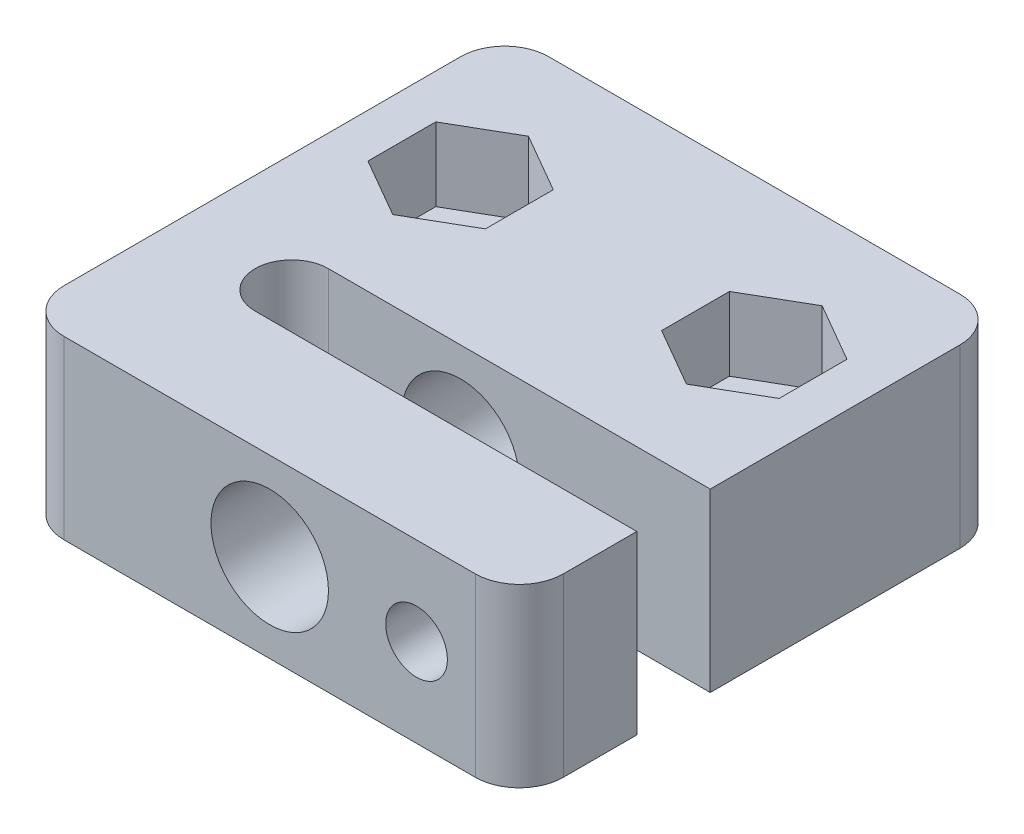
ISO-10303-21;
HEADER;
FILE_DESCRIPTION(('STEP AP214'),'2;1');
FILE_NAME('part.step','',(''),(''),'','','');
FILE_SCHEMA(('AUTOMOTIVE_DESIGN { 1 0 10303 214 1 1 1 1 }'));
ENDSEC;
DATA;
#1=APPLICATION_CONTEXT('core data for automotive mechanical design processes');
#2=APPLICATION_PROTOCOL_DEFINITION('international standard','automotive_design',2000,#1);
#3=PRODUCT_CONTEXT('',#1,'mechanical');
#4=PRODUCT('Part','Part','',(#3));
#5=PRODUCT_RELATED_PRODUCT_CATEGORY('part','',(#4));
#6=PRODUCT_DEFINITION_FORMATION('','',#4);
#7=PRODUCT_DEFINITION_CONTEXT('part definition',#1,'design');
#8=PRODUCT_DEFINITION('design','',#6,#7);
#9=PRODUCT_DEFINITION_SHAPE('','',#8);
#10=(LENGTH_UNIT() NAMED_UNIT(*) SI_UNIT(.MILLI.,.METRE.));
#11=(NAMED_UNIT(*) PLANE_ANGLE_UNIT() SI_UNIT($,.RADIAN.));
#12=(NAMED_UNIT(*) SI_UNIT($,.STERADIAN.) SOLID_ANGLE_UNIT());
#13=UNCERTAINTY_MEASURE_WITH_UNIT(LENGTH_MEASURE(1.E-05),#10,'distance_accuracy_value','');
#14=(GEOMETRIC_REPRESENTATION_CONTEXT(3) GLOBAL_UNCERTAINTY_ASSIGNED_CONTEXT((#13)) GLOBAL_UNIT_ASSIGNED_CONTEXT((#10,
#11,#12)) REPRESENTATION_CONTEXT('',''));
#15=CARTESIAN_POINT('',(0.,0.,0.));
#16=DIRECTION('',(0.,0.,1.));
#17=DIRECTION('',(1.,0.,0.));
#18=AXIS2_PLACEMENT_3D('',#15,#16,#17);
#19=CARTESIAN_POINT('',(17.,12.,-16.5));
#20=DIRECTION('',(-1.,0.,0.));
#21=DIRECTION('',(0.,0.,1.));
#22=AXIS2_PLACEMENT_3D('',#19,#20,#21);
#23=PLANE('',#22);
#24=DIRECTION('',(0.,0.,-1.));
#25=VECTOR('',#24,1.);
#26=CARTESIAN_POINT('',(17.,0.,-16.5));
#27=LINE('',#26,#25);
#28=CARTESIAN_POINT('',(17.,0.,3.5));
#29=VERTEX_POINT('',#28);
#30=CARTESIAN_POINT('',(17.,0.,-13.5));
#31=VERTEX_POINT('',#30);
#32=EDGE_CURVE('E328',#29,#31,#27,.T.);
#33=ORIENTED_EDGE('',*,*,#32,.T.);
#34=DIRECTION('',(0.,-1.,0.));
#35=VECTOR('',#34,1.);
#36=CARTESIAN_POINT('',(17.,12.,-13.5));
#37=LINE('',#36,#35);
#38=CARTESIAN_POINT('',(17.,12.,-13.5));
#39=VERTEX_POINT('',#38);
#40=EDGE_CURVE('E383',#31,#39,#37,.F.);
#41=ORIENTED_EDGE('',*,*,#40,.T.);
#42=DIRECTION('',(0.,0.,-1.));
#43=VECTOR('',#42,1.);
#44=CARTESIAN_POINT('',(17.,12.,-16.5));
#45=LINE('',#44,#43);
#46=CARTESIAN_POINT('',(17.,12.,3.5));
#47=VERTEX_POINT('',#46);
#48=EDGE_CURVE('E338',#47,#39,#45,.T.);
#49=ORIENTED_EDGE('',*,*,#48,.F.);
#50=DIRECTION('',(0.,-1.,0.));
#51=VECTOR('',#50,1.);
#52=CARTESIAN_POINT('',(17.,12.,3.5));
#53=LINE('',#52,#51);
#54=EDGE_CURVE('E325',#47,#29,#53,.T.);
#55=ORIENTED_EDGE('',*,*,#54,.T.);
#56=EDGE_LOOP('',(#33,#41,#49,#55));
#57=FACE_BOUND('',#56,.T.);
#58=ADVANCED_FACE('F37',(#57),#23,.F.);
#59=CARTESIAN_POINT('',(17.,12.,13.5));
#60=VERTEX_POINT('',#59);
#61=CARTESIAN_POINT('',(17.,12.,8.5));
#62=VERTEX_POINT('',#61);
#63=EDGE_CURVE('E335',#60,#62,#45,.T.);
#64=ORIENTED_EDGE('',*,*,#63,.F.);
#65=DIRECTION('',(0.,-1.,0.));
#66=VECTOR('',#65,1.);
#67=CARTESIAN_POINT('',(17.,12.,13.5));
#68=LINE('',#67,#66);
#69=CARTESIAN_POINT('',(17.,0.,13.5));
#70=VERTEX_POINT('',#69);
#71=EDGE_CURVE('E397',#60,#70,#68,.T.);
#72=ORIENTED_EDGE('',*,*,#71,.T.);
#73=CARTESIAN_POINT('',(17.,0.,8.5));
#74=VERTEX_POINT('',#73);
#75=EDGE_CURVE('E347',#70,#74,#27,.T.);
#76=ORIENTED_EDGE('',*,*,#75,.T.);
#77=DIRECTION('',(0.,-1.,0.));
#78=VECTOR('',#77,1.);
#79=CARTESIAN_POINT('',(17.,12.,8.5));
#80=LINE('',#79,#78);
#81=EDGE_CURVE('E318',#62,#74,#80,.T.);
#82=ORIENTED_EDGE('',*,*,#81,.F.);
#83=EDGE_LOOP('',(#64,#72,#76,#82));
#84=FACE_BOUND('',#83,.T.);
#85=ADVANCED_FACE('F415',(#84),#23,.F.);
#86=CARTESIAN_POINT('',(-17.,12.,-16.5));
#87=DIRECTION('',(0.,0.,1.));
#88=DIRECTION('',(1.,0.,0.));
#89=AXIS2_PLACEMENT_3D('',#86,#87,#88);
#90=PLANE('',#89);
#91=CARTESIAN_POINT('',(0.,6.,-16.5));
#92=DIRECTION('',(0.,0.,1.));
#93=DIRECTION('',(1.,0.,0.));
#94=AXIS2_PLACEMENT_3D('',#91,#92,#93);
#95=CIRCLE('',#94,3.99999999999999);
#96=CARTESIAN_POINT('',(3.99999999999999,6.,-16.5));
#97=VERTEX_POINT('',#96);
#98=EDGE_CURVE('E360',#97,#97,#95,.T.);
#99=ORIENTED_EDGE('',*,*,#98,.T.);
#100=EDGE_LOOP('',(#99));
#101=FACE_BOUND('',#100,.T.);
#102=DIRECTION('',(-1.,0.,0.));
#103=VECTOR('',#102,1.);
#104=CARTESIAN_POINT('',(-17.,12.,-16.5));
#105=LINE('',#104,#103);
#106=CARTESIAN_POINT('',(14.,12.,-16.5));
#107=VERTEX_POINT('',#106);
#108=CARTESIAN_POINT('',(-14.,12.,-16.5));
#109=VERTEX_POINT('',#108);
#110=EDGE_CURVE('E337',#107,#109,#105,.T.);
#111=ORIENTED_EDGE('',*,*,#110,.F.);
#112=DIRECTION('',(0.,-1.,0.));
#113=VECTOR('',#112,1.);
#114=CARTESIAN_POINT('',(14.,12.,-16.5));
#115=LINE('',#114,#113);
#116=CARTESIAN_POINT('',(14.,0.,-16.5));
#117=VERTEX_POINT('',#116);
#118=EDGE_CURVE('E372',#107,#117,#115,.T.);
#119=ORIENTED_EDGE('',*,*,#118,.T.);
#120=DIRECTION('',(-1.,0.,0.));
#121=VECTOR('',#120,1.);
#122=CARTESIAN_POINT('',(-17.,0.,-16.5));
#123=LINE('',#122,#121);
#124=CARTESIAN_POINT('',(-14.,0.,-16.5));
#125=VERTEX_POINT('',#124);
#126=EDGE_CURVE('E349',#117,#125,#123,.T.);
#127=ORIENTED_EDGE('',*,*,#126,.T.);
#128=DIRECTION('',(0.,-1.,0.));
#129=VECTOR('',#128,1.);
#130=CARTESIAN_POINT('',(-14.,12.,-16.5));
#131=LINE('',#130,#129);
#132=EDGE_CURVE('E346',#125,#109,#131,.F.);
#133=ORIENTED_EDGE('',*,*,#132,.T.);
#134=EDGE_LOOP('',(#111,#119,#127,#133));
#135=FACE_BOUND('',#134,.T.);
#136=ADVANCED_FACE('F440',(#101,#135),#90,.F.);
#137=CARTESIAN_POINT('',(-17.,12.,-16.5));
#138=DIRECTION('',(1.,0.,0.));
#139=DIRECTION('',(0.,0.,-1.));
#140=AXIS2_PLACEMENT_3D('',#137,#138,#139);
#141=PLANE('',#140);
#142=DIRECTION('',(0.,0.,1.));
#143=VECTOR('',#142,1.);
#144=CARTESIAN_POINT('',(-17.,12.,-16.5));
#145=LINE('',#144,#143);
#146=CARTESIAN_POINT('',(-17.,12.,-13.5));
#147=VERTEX_POINT('',#146);
#148=CARTESIAN_POINT('',(-17.,12.,13.5));
#149=VERTEX_POINT('',#148);
#150=EDGE_CURVE('E341',#147,#149,#145,.T.);
#151=ORIENTED_EDGE('',*,*,#150,.F.);
#152=DIRECTION('',(0.,-1.,0.));
#153=VECTOR('',#152,1.);
#154=CARTESIAN_POINT('',(-17.,12.,-13.5));
#155=LINE('',#154,#153);
#156=CARTESIAN_POINT('',(-17.,0.,-13.5));
#157=VERTEX_POINT('',#156);
#158=EDGE_CURVE('E394',#147,#157,#155,.T.);
#159=ORIENTED_EDGE('',*,*,#158,.T.);
#160=DIRECTION('',(0.,0.,1.));
#161=VECTOR('',#160,1.);
#162=CARTESIAN_POINT('',(-17.,0.,-16.5));
#163=LINE('',#162,#161);
#164=CARTESIAN_POINT('',(-17.,0.,13.5));
#165=VERTEX_POINT('',#164);
#166=EDGE_CURVE('E352',#157,#165,#163,.T.);
#167=ORIENTED_EDGE('',*,*,#166,.T.);
#168=DIRECTION('',(0.,-1.,0.));
#169=VECTOR('',#168,1.);
#170=CARTESIAN_POINT('',(-17.,12.,13.5));
#171=LINE('',#170,#169);
#172=EDGE_CURVE('E392',#165,#149,#171,.F.);
#173=ORIENTED_EDGE('',*,*,#172,.T.);
#174=EDGE_LOOP('',(#151,#159,#167,#173));
#175=FACE_BOUND('',#174,.T.);
#176=ADVANCED_FACE('F447',(#175),#141,.F.);
#177=CARTESIAN_POINT('',(-17.,12.,16.5));
#178=DIRECTION('',(0.,0.,-1.));
#179=DIRECTION('',(-1.,0.,0.));
#180=AXIS2_PLACEMENT_3D('',#177,#178,#179);
#181=PLANE('',#180);
#182=CARTESIAN_POINT('',(10.,6.,16.5));
#183=DIRECTION('',(0.,0.,1.));
#184=DIRECTION('',(1.,0.,0.));
#185=AXIS2_PLACEMENT_3D('',#182,#183,#184);
#186=CIRCLE('',#185,2.09999999999999);
#187=CARTESIAN_POINT('',(12.1,6.,16.5));
#188=VERTEX_POINT('',#187);
#189=EDGE_CURVE('E364',#188,#188,#186,.T.);
#190=ORIENTED_EDGE('',*,*,#189,.F.);
#191=EDGE_LOOP('',(#190));
#192=FACE_BOUND('',#191,.T.);
#193=CARTESIAN_POINT('',(0.,6.,16.5));
#194=DIRECTION('',(0.,0.,1.));
#195=DIRECTION('',(1.,0.,0.));
#196=AXIS2_PLACEMENT_3D('',#193,#194,#195);
#197=CIRCLE('',#196,4.);
#198=CARTESIAN_POINT('',(4.,6.,16.5));
#199=VERTEX_POINT('',#198);
#200=EDGE_CURVE('E521',#199,#199,#197,.T.);
#201=ORIENTED_EDGE('',*,*,#200,.F.);
#202=EDGE_LOOP('',(#201));
#203=FACE_BOUND('',#202,.T.);
#204=DIRECTION('',(1.,0.,0.));
#205=VECTOR('',#204,1.);
#206=CARTESIAN_POINT('',(-17.,0.,16.5));
#207=LINE('',#206,#205);
#208=CARTESIAN_POINT('',(-14.,0.,16.5));
#209=VERTEX_POINT('',#208);
#210=CARTESIAN_POINT('',(14.,0.,16.5));
#211=VERTEX_POINT('',#210);
#212=EDGE_CURVE('E355',#209,#211,#207,.T.);
#213=ORIENTED_EDGE('',*,*,#212,.T.);
#214=DIRECTION('',(0.,-1.,0.));
#215=VECTOR('',#214,1.);
#216=CARTESIAN_POINT('',(14.,12.,16.5));
#217=LINE('',#216,#215);
#218=CARTESIAN_POINT('',(14.,12.,16.5));
#219=VERTEX_POINT('',#218);
#220=EDGE_CURVE('E11',#211,#219,#217,.F.);
#221=ORIENTED_EDGE('',*,*,#220,.T.);
#222=DIRECTION('',(1.,0.,0.));
#223=VECTOR('',#222,1.);
#224=CARTESIAN_POINT('',(-17.,12.,16.5));
#225=LINE('',#224,#223);
#226=CARTESIAN_POINT('',(-14.,12.,16.5));
#227=VERTEX_POINT('',#226);
#228=EDGE_CURVE('E344',#227,#219,#225,.T.);
#229=ORIENTED_EDGE('',*,*,#228,.F.);
#230=DIRECTION('',(0.,-1.,0.));
#231=VECTOR('',#230,1.);
#232=CARTESIAN_POINT('',(-14.,12.,16.5));
#233=LINE('',#232,#231);
#234=EDGE_CURVE('E45',#227,#209,#233,.T.);
#235=ORIENTED_EDGE('',*,*,#234,.T.);
#236=EDGE_LOOP('',(#213,#221,#229,#235));
#237=FACE_BOUND('',#236,.T.);
#238=ADVANCED_FACE('F402',(#192,#203,#237),#181,.F.);
#239=CARTESIAN_POINT('',(0.,12.,0.));
#240=DIRECTION('',(0.,1.,0.));
#241=DIRECTION('',(0.,0.,1.));
#242=AXIS2_PLACEMENT_3D('',#239,#240,#241);
#243=PLANE('',#242);
#244=DIRECTION('',(0.866025403784439,0.,0.5));
#245=VECTOR('',#244,1.);
#246=CARTESIAN_POINT('',(-14.0010373654841,12.,-4.19));
#247=LINE('',#246,#245);
#248=CARTESIAN_POINT('',(-14.0010373654841,12.,-4.19));
#249=VERTEX_POINT('',#248);
#250=CARTESIAN_POINT('',(-10.,12.,-1.88));
#251=VERTEX_POINT('',#250);
#252=EDGE_CURVE('E205',#249,#251,#247,.T.);
#253=ORIENTED_EDGE('',*,*,#252,.F.);
#254=DIRECTION('',(0.,0.,1.));
#255=VECTOR('',#254,1.);
#256=CARTESIAN_POINT('',(-14.0010373654841,12.,-8.81));
#257=LINE('',#256,#255);
#258=CARTESIAN_POINT('',(-14.0010373654841,12.,-8.81));
#259=VERTEX_POINT('',#258);
#260=EDGE_CURVE('E223',#259,#249,#257,.T.);
#261=ORIENTED_EDGE('',*,*,#260,.F.);
#262=DIRECTION('',(-0.866025403784439,0.,0.5));
#263=VECTOR('',#262,1.);
#264=CARTESIAN_POINT('',(-10.,12.,-11.12));
#265=LINE('',#264,#263);
#266=CARTESIAN_POINT('',(-10.,12.,-11.12));
#267=VERTEX_POINT('',#266);
#268=EDGE_CURVE('E226',#267,#259,#265,.T.);
#269=ORIENTED_EDGE('',*,*,#268,.F.);
#270=DIRECTION('',(-0.866025403784439,0.,-0.5));
#271=VECTOR('',#270,1.);
#272=CARTESIAN_POINT('',(-5.99896263451589,12.,-8.81));
#273=LINE('',#272,#271);
#274=CARTESIAN_POINT('',(-5.99896263451589,12.,-8.81));
#275=VERTEX_POINT('',#274);
#276=EDGE_CURVE('E246',#275,#267,#273,.T.);
#277=ORIENTED_EDGE('',*,*,#276,.F.);
#278=DIRECTION('',(0.,0.,-1.));
#279=VECTOR('',#278,1.);
#280=CARTESIAN_POINT('',(-5.99896263451589,12.,-4.19));
#281=LINE('',#280,#279);
#282=CARTESIAN_POINT('',(-5.99896263451589,12.,-4.19));
#283=VERTEX_POINT('',#282);
#284=EDGE_CURVE('E243',#283,#275,#281,.T.);
#285=ORIENTED_EDGE('',*,*,#284,.F.);
#286=DIRECTION('',(0.866025403784439,0.,-0.5));
#287=VECTOR('',#286,1.);
#288=CARTESIAN_POINT('',(-10.,12.,-1.88));
#289=LINE('',#288,#287);
#290=EDGE_CURVE('E240',#251,#283,#289,.T.);
#291=ORIENTED_EDGE('',*,*,#290,.F.);
#292=EDGE_LOOP('',(#253,#261,#269,#277,#285,#291));
#293=FACE_BOUND('',#292,.T.);
#294=DIRECTION('',(0.,0.,-1.));
#295=VECTOR('',#294,1.);
#296=CARTESIAN_POINT('',(14.0010373654841,12.,-8.81));
#297=LINE('',#296,#295);
#298=CARTESIAN_POINT('',(14.0010373654841,12.,-4.19000000000001));
#299=VERTEX_POINT('',#298);
#300=CARTESIAN_POINT('',(14.0010373654841,12.,-8.81000000000001));
#301=VERTEX_POINT('',#300);
#302=EDGE_CURVE('E281',#299,#301,#297,.T.);
#303=ORIENTED_EDGE('',*,*,#302,.F.);
#304=DIRECTION('',(0.866025403784438,0.,-0.500000000000001));
#305=VECTOR('',#304,1.);
#306=CARTESIAN_POINT('',(14.0010373654841,12.,-4.19000000000001));
#307=LINE('',#306,#305);
#308=CARTESIAN_POINT('',(10.,12.,-1.88));
#309=VERTEX_POINT('',#308);
#310=EDGE_CURVE('E265',#309,#299,#307,.T.);
#311=ORIENTED_EDGE('',*,*,#310,.F.);
#312=DIRECTION('',(0.866025403784439,0.,0.5));
#313=VECTOR('',#312,1.);
#314=CARTESIAN_POINT('',(10.,12.,-1.88));
#315=LINE('',#314,#313);
#316=CARTESIAN_POINT('',(5.99896263451591,12.,-4.19));
#317=VERTEX_POINT('',#316);
#318=EDGE_CURVE('E292',#317,#309,#315,.T.);
#319=ORIENTED_EDGE('',*,*,#318,.F.);
#320=DIRECTION('',(0.,0.,1.));
#321=VECTOR('',#320,1.);
#322=CARTESIAN_POINT('',(5.99896263451591,12.,-4.19));
#323=LINE('',#322,#321);
#324=CARTESIAN_POINT('',(5.99896263451591,12.,-8.81));
#325=VERTEX_POINT('',#324);
#326=EDGE_CURVE('E289',#325,#317,#323,.T.);
#327=ORIENTED_EDGE('',*,*,#326,.F.);
#328=DIRECTION('',(-0.866025403784438,0.,0.5));
#329=VECTOR('',#328,1.);
#330=CARTESIAN_POINT('',(5.99896263451591,12.,-8.81));
#331=LINE('',#330,#329);
#332=CARTESIAN_POINT('',(10.,12.,-11.12));
#333=VERTEX_POINT('',#332);
#334=EDGE_CURVE('E286',#333,#325,#331,.T.);
#335=ORIENTED_EDGE('',*,*,#334,.F.);
#336=DIRECTION('',(-0.866025403784439,0.,-0.5));
#337=VECTOR('',#336,1.);
#338=CARTESIAN_POINT('',(10.,12.,-11.12));
#339=LINE('',#338,#337);
#340=EDGE_CURVE('E283',#301,#333,#339,.T.);
#341=ORIENTED_EDGE('',*,*,#340,.F.);
#342=EDGE_LOOP('',(#303,#311,#319,#327,#335,#341));
#343=FACE_BOUND('',#342,.T.);
#344=ORIENTED_EDGE('',*,*,#48,.T.);
#345=CARTESIAN_POINT('',(14.,12.,-13.5));
#346=DIRECTION('',(0.,1.,0.));
#347=DIRECTION('',(0.,0.,1.));
#348=AXIS2_PLACEMENT_3D('',#345,#346,#347);
#349=CIRCLE('',#348,3.);
#350=EDGE_CURVE('E390',#39,#107,#349,.T.);
#351=ORIENTED_EDGE('',*,*,#350,.T.);
#352=ORIENTED_EDGE('',*,*,#110,.T.);
#353=CARTESIAN_POINT('',(-14.,12.,-13.5));
#354=DIRECTION('',(0.,1.,0.));
#355=DIRECTION('',(0.,0.,1.));
#356=AXIS2_PLACEMENT_3D('',#353,#354,#355);
#357=CIRCLE('',#356,3.);
#358=EDGE_CURVE('E388',#109,#147,#357,.T.);
#359=ORIENTED_EDGE('',*,*,#358,.T.);
#360=ORIENTED_EDGE('',*,*,#150,.T.);
#361=CARTESIAN_POINT('',(-14.,12.,13.5));
#362=DIRECTION('',(0.,1.,0.));
#363=DIRECTION('',(0.,0.,1.));
#364=AXIS2_PLACEMENT_3D('',#361,#362,#363);
#365=CIRCLE('',#364,3.);
#366=EDGE_CURVE('E385',#149,#227,#365,.T.);
#367=ORIENTED_EDGE('',*,*,#366,.T.);
#368=ORIENTED_EDGE('',*,*,#228,.T.);
#369=CARTESIAN_POINT('',(14.,12.,13.5));
#370=DIRECTION('',(0.,1.,0.));
#371=DIRECTION('',(0.,0.,1.));
#372=AXIS2_PLACEMENT_3D('',#369,#370,#371);
#373=CIRCLE('',#372,3.);
#374=EDGE_CURVE('E52',#219,#60,#373,.T.);
#375=ORIENTED_EDGE('',*,*,#374,.T.);
#376=ORIENTED_EDGE('',*,*,#63,.T.);
#377=DIRECTION('',(-1.,0.,0.));
#378=VECTOR('',#377,1.);
#379=CARTESIAN_POINT('',(17.,12.,8.5));
#380=LINE('',#379,#378);
#381=CARTESIAN_POINT('',(-8.99999999999999,12.,8.5));
#382=VERTEX_POINT('',#381);
#383=EDGE_CURVE('E308',#62,#382,#380,.T.);
#384=ORIENTED_EDGE('',*,*,#383,.T.);
#385=CARTESIAN_POINT('',(-8.99999999999999,12.,6.));
#386=DIRECTION('',(0.,-1.,0.));
#387=DIRECTION('',(0.,0.,-1.));
#388=AXIS2_PLACEMENT_3D('',#385,#386,#387);
#389=CIRCLE('',#388,2.5);
#390=CARTESIAN_POINT('',(-8.99999999999999,12.,3.5));
#391=VERTEX_POINT('',#390);
#392=EDGE_CURVE('E311',#382,#391,#389,.T.);
#393=ORIENTED_EDGE('',*,*,#392,.T.);
#394=DIRECTION('',(1.,0.,0.));
#395=VECTOR('',#394,1.);
#396=CARTESIAN_POINT('',(17.,12.,3.5));
#397=LINE('',#396,#395);
#398=EDGE_CURVE('E315',#391,#47,#397,.T.);
#399=ORIENTED_EDGE('',*,*,#398,.T.);
#400=EDGE_LOOP('',(#344,#351,#352,#359,#360,#367,#368,#375,#376,#384,#393,#399));
#401=FACE_BOUND('',#400,.T.);
#402=ADVANCED_FACE('F419',(#293,#343,#401),#243,.T.);
#403=CARTESIAN_POINT('',(0.,0.,0.));
#404=DIRECTION('',(0.,1.,0.));
#405=DIRECTION('',(0.,0.,1.));
#406=AXIS2_PLACEMENT_3D('',#403,#404,#405);
#407=PLANE('',#406);
#408=CARTESIAN_POINT('',(-10.,0.,-6.5));
#409=DIRECTION('',(0.,-1.,0.));
#410=DIRECTION('',(0.,0.,-1.));
#411=AXIS2_PLACEMENT_3D('',#408,#409,#410);
#412=CIRCLE('',#411,4.5);
#413=CARTESIAN_POINT('',(-10.,0.,-11.));
#414=VERTEX_POINT('',#413);
#415=EDGE_CURVE('E542',#414,#414,#412,.T.);
#416=ORIENTED_EDGE('',*,*,#415,.F.);
#417=EDGE_LOOP('',(#416));
#418=FACE_BOUND('',#417,.T.);
#419=CARTESIAN_POINT('',(10.,0.,-6.5));
#420=DIRECTION('',(0.,-1.,0.));
#421=DIRECTION('',(0.,0.,-1.));
#422=AXIS2_PLACEMENT_3D('',#419,#420,#421);
#423=CIRCLE('',#422,4.5);
#424=CARTESIAN_POINT('',(10.,0.,-11.));
#425=VERTEX_POINT('',#424);
#426=EDGE_CURVE('E369',#425,#425,#423,.T.);
#427=ORIENTED_EDGE('',*,*,#426,.F.);
#428=EDGE_LOOP('',(#427));
#429=FACE_BOUND('',#428,.T.);
#430=ORIENTED_EDGE('',*,*,#126,.F.);
#431=CARTESIAN_POINT('',(14.,0.,-13.5));
#432=DIRECTION('',(0.,1.,0.));
#433=DIRECTION('',(0.,0.,1.));
#434=AXIS2_PLACEMENT_3D('',#431,#432,#433);
#435=CIRCLE('',#434,3.);
#436=EDGE_CURVE('E381',#117,#31,#435,.F.);
#437=ORIENTED_EDGE('',*,*,#436,.T.);
#438=ORIENTED_EDGE('',*,*,#32,.F.);
#439=DIRECTION('',(1.,0.,0.));
#440=VECTOR('',#439,1.);
#441=CARTESIAN_POINT('',(17.,0.,3.5));
#442=LINE('',#441,#440);
#443=CARTESIAN_POINT('',(-8.99999999999999,0.,3.5));
#444=VERTEX_POINT('',#443);
#445=EDGE_CURVE('E312',#444,#29,#442,.T.);
#446=ORIENTED_EDGE('',*,*,#445,.F.);
#447=CARTESIAN_POINT('',(-8.99999999999999,0.,6.));
#448=DIRECTION('',(0.,-1.,0.));
#449=DIRECTION('',(0.,0.,-1.));
#450=AXIS2_PLACEMENT_3D('',#447,#448,#449);
#451=CIRCLE('',#450,2.5);
#452=CARTESIAN_POINT('',(-8.99999999999999,0.,8.5));
#453=VERTEX_POINT('',#452);
#454=EDGE_CURVE('E321',#453,#444,#451,.T.);
#455=ORIENTED_EDGE('',*,*,#454,.F.);
#456=DIRECTION('',(-1.,0.,0.));
#457=VECTOR('',#456,1.);
#458=CARTESIAN_POINT('',(17.,0.,8.5));
#459=LINE('',#458,#457);
#460=EDGE_CURVE('E253',#74,#453,#459,.T.);
#461=ORIENTED_EDGE('',*,*,#460,.F.);
#462=ORIENTED_EDGE('',*,*,#75,.F.);
#463=CARTESIAN_POINT('',(14.,0.,13.5));
#464=DIRECTION('',(0.,1.,0.));
#465=DIRECTION('',(0.,0.,1.));
#466=AXIS2_PLACEMENT_3D('',#463,#464,#465);
#467=CIRCLE('',#466,3.);
#468=EDGE_CURVE('E377',#70,#211,#467,.F.);
#469=ORIENTED_EDGE('',*,*,#468,.T.);
#470=ORIENTED_EDGE('',*,*,#212,.F.);
#471=CARTESIAN_POINT('',(-14.,0.,13.5));
#472=DIRECTION('',(0.,1.,0.));
#473=DIRECTION('',(0.,0.,1.));
#474=AXIS2_PLACEMENT_3D('',#471,#472,#473);
#475=CIRCLE('',#474,3.);
#476=EDGE_CURVE('E375',#209,#165,#475,.F.);
#477=ORIENTED_EDGE('',*,*,#476,.T.);
#478=ORIENTED_EDGE('',*,*,#166,.F.);
#479=CARTESIAN_POINT('',(-14.,0.,-13.5));
#480=DIRECTION('',(0.,1.,0.));
#481=DIRECTION('',(0.,0.,1.));
#482=AXIS2_PLACEMENT_3D('',#479,#480,#481);
#483=CIRCLE('',#482,3.);
#484=EDGE_CURVE('E379',#157,#125,#483,.F.);
#485=ORIENTED_EDGE('',*,*,#484,.T.);
#486=EDGE_LOOP('',(#430,#437,#438,#446,#455,#461,#462,#469,#470,#477,#478,#485));
#487=FACE_BOUND('',#486,.T.);
#488=ADVANCED_FACE('F407',(#418,#429,#487),#407,.F.);
#489=CARTESIAN_POINT('',(17.,12.,3.5));
#490=DIRECTION('',(0.,0.,-1.));
#491=DIRECTION('',(-1.,0.,0.));
#492=AXIS2_PLACEMENT_3D('',#489,#490,#491);
#493=PLANE('',#492);
#494=CARTESIAN_POINT('',(0.,6.,3.5));
#495=DIRECTION('',(0.,0.,-1.));
#496=DIRECTION('',(-1.,0.,0.));
#497=AXIS2_PLACEMENT_3D('',#494,#495,#496);
#498=CIRCLE('',#497,4.);
#499=CARTESIAN_POINT('',(-4.,6.,3.5));
#500=VERTEX_POINT('',#499);
#501=EDGE_CURVE('E229',#500,#500,#498,.T.);
#502=ORIENTED_EDGE('',*,*,#501,.T.);
#503=EDGE_LOOP('',(#502));
#504=FACE_BOUND('',#503,.T.);
#505=ORIENTED_EDGE('',*,*,#445,.T.);
#506=ORIENTED_EDGE('',*,*,#54,.F.);
#507=ORIENTED_EDGE('',*,*,#398,.F.);
#508=DIRECTION('',(0.,-1.,0.));
#509=VECTOR('',#508,1.);
#510=CARTESIAN_POINT('',(-8.99999999999999,12.,3.5));
#511=LINE('',#510,#509);
#512=EDGE_CURVE('E329',#391,#444,#511,.T.);
#513=ORIENTED_EDGE('',*,*,#512,.T.);
#514=EDGE_LOOP('',(#505,#506,#507,#513));
#515=FACE_BOUND('',#514,.T.);
#516=ADVANCED_FACE('F485',(#504,#515),#493,.F.);
#517=CARTESIAN_POINT('',(-8.99999999999999,12.,6.));
#518=DIRECTION('',(0.,-1.,0.));
#519=DIRECTION('',(0.,0.,-1.));
#520=AXIS2_PLACEMENT_3D('',#517,#518,#519);
#521=CYLINDRICAL_SURFACE('',#520,2.5);
#522=ORIENTED_EDGE('',*,*,#454,.T.);
#523=ORIENTED_EDGE('',*,*,#512,.F.);
#524=ORIENTED_EDGE('',*,*,#392,.F.);
#525=DIRECTION('',(0.,-1.,0.));
#526=VECTOR('',#525,1.);
#527=CARTESIAN_POINT('',(-8.99999999999999,12.,8.5));
#528=LINE('',#527,#526);
#529=EDGE_CURVE('E331',#382,#453,#528,.T.);
#530=ORIENTED_EDGE('',*,*,#529,.T.);
#531=EDGE_LOOP('',(#522,#523,#524,#530));
#532=FACE_BOUND('',#531,.T.);
#533=ADVANCED_FACE('F425',(#532),#521,.F.);
#534=CARTESIAN_POINT('',(17.,12.,8.5));
#535=DIRECTION('',(0.,0.,1.));
#536=DIRECTION('',(1.,0.,0.));
#537=AXIS2_PLACEMENT_3D('',#534,#535,#536);
#538=PLANE('',#537);
#539=CARTESIAN_POINT('',(10.,6.,8.5));
#540=DIRECTION('',(0.,0.,1.));
#541=DIRECTION('',(1.,0.,0.));
#542=AXIS2_PLACEMENT_3D('',#539,#540,#541);
#543=CIRCLE('',#542,2.09999999999999);
#544=CARTESIAN_POINT('',(12.1,6.,8.5));
#545=VERTEX_POINT('',#544);
#546=EDGE_CURVE('E523',#545,#545,#543,.T.);
#547=ORIENTED_EDGE('',*,*,#546,.T.);
#548=EDGE_LOOP('',(#547));
#549=FACE_BOUND('',#548,.T.);
#550=CARTESIAN_POINT('',(0.,6.,8.5));
#551=DIRECTION('',(0.,0.,1.));
#552=DIRECTION('',(1.,0.,0.));
#553=AXIS2_PLACEMENT_3D('',#550,#551,#552);
#554=CIRCLE('',#553,4.);
#555=CARTESIAN_POINT('',(4.,6.,8.5));
#556=VERTEX_POINT('',#555);
#557=EDGE_CURVE('E357',#556,#556,#554,.T.);
#558=ORIENTED_EDGE('',*,*,#557,.T.);
#559=EDGE_LOOP('',(#558));
#560=FACE_BOUND('',#559,.T.);
#561=ORIENTED_EDGE('',*,*,#460,.T.);
#562=ORIENTED_EDGE('',*,*,#529,.F.);
#563=ORIENTED_EDGE('',*,*,#383,.F.);
#564=ORIENTED_EDGE('',*,*,#81,.T.);
#565=EDGE_LOOP('',(#561,#562,#563,#564));
#566=FACE_BOUND('',#565,.T.);
#567=ADVANCED_FACE('F421',(#549,#560,#566),#538,.F.);
#568=CARTESIAN_POINT('',(14.0010373654841,7.,-8.81));
#569=DIRECTION('',(1.,0.,0.));
#570=DIRECTION('',(0.,0.,-1.));
#571=AXIS2_PLACEMENT_3D('',#568,#569,#570);
#572=PLANE('',#571);
#573=ORIENTED_EDGE('',*,*,#302,.T.);
#574=DIRECTION('',(0.,1.,0.));
#575=VECTOR('',#574,1.);
#576=CARTESIAN_POINT('',(14.0010373654841,7.,-8.81));
#577=LINE('',#576,#575);
#578=CARTESIAN_POINT('',(14.0010373654841,7.,-8.81));
#579=VERTEX_POINT('',#578);
#580=EDGE_CURVE('E280',#579,#301,#577,.T.);
#581=ORIENTED_EDGE('',*,*,#580,.F.);
#582=DIRECTION('',(0.,0.,-1.));
#583=VECTOR('',#582,1.);
#584=CARTESIAN_POINT('',(14.0010373654841,7.,-8.81));
#585=LINE('',#584,#583);
#586=CARTESIAN_POINT('',(14.0010373654841,7.,-4.19000000000001));
#587=VERTEX_POINT('',#586);
#588=EDGE_CURVE('E261',#587,#579,#585,.T.);
#589=ORIENTED_EDGE('',*,*,#588,.F.);
#590=DIRECTION('',(0.,1.,0.));
#591=VECTOR('',#590,1.);
#592=CARTESIAN_POINT('',(14.0010373654841,7.,-4.19000000000001));
#593=LINE('',#592,#591);
#594=EDGE_CURVE('E241',#587,#299,#593,.T.);
#595=ORIENTED_EDGE('',*,*,#594,.T.);
#596=EDGE_LOOP('',(#573,#581,#589,#595));
#597=FACE_BOUND('',#596,.T.);
#598=ADVANCED_FACE('F611',(#597),#572,.F.);
#599=CARTESIAN_POINT('',(14.0010373654841,7.,-4.19000000000001));
#600=DIRECTION('',(0.500000000000001,0.,0.866025403784438));
#601=DIRECTION('',(0.866025403784438,0.,-0.500000000000001));
#602=AXIS2_PLACEMENT_3D('',#599,#600,#601);
#603=PLANE('',#602);
#604=ORIENTED_EDGE('',*,*,#310,.T.);
#605=ORIENTED_EDGE('',*,*,#594,.F.);
#606=DIRECTION('',(0.866025403784438,0.,-0.500000000000001));
#607=VECTOR('',#606,1.);
#608=CARTESIAN_POINT('',(14.0010373654841,7.,-4.19000000000001));
#609=LINE('',#608,#607);
#610=CARTESIAN_POINT('',(10.,7.,-1.88));
#611=VERTEX_POINT('',#610);
#612=EDGE_CURVE('E277',#611,#587,#609,.T.);
#613=ORIENTED_EDGE('',*,*,#612,.F.);
#614=DIRECTION('',(0.,1.,0.));
#615=VECTOR('',#614,1.);
#616=CARTESIAN_POINT('',(10.,7.,-1.88));
#617=LINE('',#616,#615);
#618=EDGE_CURVE('E298',#611,#309,#617,.T.);
#619=ORIENTED_EDGE('',*,*,#618,.T.);
#620=EDGE_LOOP('',(#604,#605,#613,#619));
#621=FACE_BOUND('',#620,.T.);
#622=ADVANCED_FACE('F607',(#621),#603,.F.);
#623=CARTESIAN_POINT('',(10.,7.,-1.88));
#624=DIRECTION('',(-0.5,0.,0.866025403784439));
#625=DIRECTION('',(0.866025403784439,0.,0.5));
#626=AXIS2_PLACEMENT_3D('',#623,#624,#625);
#627=PLANE('',#626);
#628=ORIENTED_EDGE('',*,*,#318,.T.);
#629=ORIENTED_EDGE('',*,*,#618,.F.);
#630=DIRECTION('',(0.866025403784439,0.,0.5));
#631=VECTOR('',#630,1.);
#632=CARTESIAN_POINT('',(10.,7.,-1.88));
#633=LINE('',#632,#631);
#634=CARTESIAN_POINT('',(5.99896263451591,7.,-4.19));
#635=VERTEX_POINT('',#634);
#636=EDGE_CURVE('E274',#635,#611,#633,.T.);
#637=ORIENTED_EDGE('',*,*,#636,.F.);
#638=DIRECTION('',(0.,1.,0.));
#639=VECTOR('',#638,1.);
#640=CARTESIAN_POINT('',(5.99896263451591,7.,-4.19));
#641=LINE('',#640,#639);
#642=EDGE_CURVE('E300',#635,#317,#641,.T.);
#643=ORIENTED_EDGE('',*,*,#642,.T.);
#644=EDGE_LOOP('',(#628,#629,#637,#643));
#645=FACE_BOUND('',#644,.T.);
#646=ADVANCED_FACE('F610',(#645),#627,.F.);
#647=CARTESIAN_POINT('',(5.99896263451591,7.,-4.19));
#648=DIRECTION('',(-1.,0.,0.));
#649=DIRECTION('',(0.,0.,1.));
#650=AXIS2_PLACEMENT_3D('',#647,#648,#649);
#651=PLANE('',#650);
#652=ORIENTED_EDGE('',*,*,#326,.T.);
#653=ORIENTED_EDGE('',*,*,#642,.F.);
#654=DIRECTION('',(0.,0.,1.));
#655=VECTOR('',#654,1.);
#656=CARTESIAN_POINT('',(5.99896263451591,7.,-4.19));
#657=LINE('',#656,#655);
#658=CARTESIAN_POINT('',(5.99896263451591,7.,-8.81));
#659=VERTEX_POINT('',#658);
#660=EDGE_CURVE('E271',#659,#635,#657,.T.);
#661=ORIENTED_EDGE('',*,*,#660,.F.);
#662=DIRECTION('',(0.,1.,0.));
#663=VECTOR('',#662,1.);
#664=CARTESIAN_POINT('',(5.99896263451591,7.,-8.81));
#665=LINE('',#664,#663);
#666=EDGE_CURVE('E302',#659,#325,#665,.T.);
#667=ORIENTED_EDGE('',*,*,#666,.T.);
#668=EDGE_LOOP('',(#652,#653,#661,#667));
#669=FACE_BOUND('',#668,.T.);
#670=ADVANCED_FACE('F615',(#669),#651,.F.);
#671=CARTESIAN_POINT('',(5.99896263451591,7.,-8.81));
#672=DIRECTION('',(-0.5,0.,-0.866025403784438));
#673=DIRECTION('',(-0.866025403784438,0.,0.5));
#674=AXIS2_PLACEMENT_3D('',#671,#672,#673);
#675=PLANE('',#674);
#676=ORIENTED_EDGE('',*,*,#334,.T.);
#677=ORIENTED_EDGE('',*,*,#666,.F.);
#678=DIRECTION('',(-0.866025403784438,0.,0.5));
#679=VECTOR('',#678,1.);
#680=CARTESIAN_POINT('',(5.99896263451591,7.,-8.81));
#681=LINE('',#680,#679);
#682=CARTESIAN_POINT('',(10.,7.,-11.12));
#683=VERTEX_POINT('',#682);
#684=EDGE_CURVE('E268',#683,#659,#681,.T.);
#685=ORIENTED_EDGE('',*,*,#684,.F.);
#686=DIRECTION('',(0.,1.,0.));
#687=VECTOR('',#686,1.);
#688=CARTESIAN_POINT('',(10.,7.,-11.12));
#689=LINE('',#688,#687);
#690=EDGE_CURVE('E304',#683,#333,#689,.T.);
#691=ORIENTED_EDGE('',*,*,#690,.T.);
#692=EDGE_LOOP('',(#676,#677,#685,#691));
#693=FACE_BOUND('',#692,.T.);
#694=ADVANCED_FACE('F619',(#693),#675,.F.);
#695=CARTESIAN_POINT('',(10.,7.,-11.12));
#696=DIRECTION('',(0.5,0.,-0.866025403784439));
#697=DIRECTION('',(-0.866025403784439,0.,-0.5));
#698=AXIS2_PLACEMENT_3D('',#695,#696,#697);
#699=PLANE('',#698);
#700=ORIENTED_EDGE('',*,*,#340,.T.);
#701=ORIENTED_EDGE('',*,*,#690,.F.);
#702=DIRECTION('',(-0.866025403784439,0.,-0.5));
#703=VECTOR('',#702,1.);
#704=CARTESIAN_POINT('',(10.,7.,-11.12));
#705=LINE('',#704,#703);
#706=EDGE_CURVE('E264',#579,#683,#705,.T.);
#707=ORIENTED_EDGE('',*,*,#706,.F.);
#708=ORIENTED_EDGE('',*,*,#580,.T.);
#709=EDGE_LOOP('',(#700,#701,#707,#708));
#710=FACE_BOUND('',#709,.T.);
#711=ADVANCED_FACE('F605',(#710),#699,.F.);
#712=CARTESIAN_POINT('',(0.,7.,0.));
#713=DIRECTION('',(0.,-1.,0.));
#714=DIRECTION('',(0.,0.,-1.));
#715=AXIS2_PLACEMENT_3D('',#712,#713,#714);
#716=PLANE('',#715);
#717=CARTESIAN_POINT('',(10.,7.,-6.5));
#718=DIRECTION('',(0.,-1.,0.));
#719=DIRECTION('',(0.,0.,-1.));
#720=AXIS2_PLACEMENT_3D('',#717,#718,#719);
#721=CIRCLE('',#720,2.55);
#722=CARTESIAN_POINT('',(10.,7.,-9.05));
#723=VERTEX_POINT('',#722);
#724=EDGE_CURVE('E361',#723,#723,#721,.T.);
#725=ORIENTED_EDGE('',*,*,#724,.T.);
#726=EDGE_LOOP('',(#725));
#727=FACE_BOUND('',#726,.T.);
#728=ORIENTED_EDGE('',*,*,#588,.T.);
#729=ORIENTED_EDGE('',*,*,#706,.T.);
#730=ORIENTED_EDGE('',*,*,#684,.T.);
#731=ORIENTED_EDGE('',*,*,#660,.T.);
#732=ORIENTED_EDGE('',*,*,#636,.T.);
#733=ORIENTED_EDGE('',*,*,#612,.T.);
#734=EDGE_LOOP('',(#728,#729,#730,#731,#732,#733));
#735=FACE_BOUND('',#734,.T.);
#736=ADVANCED_FACE('F602',(#727,#735),#716,.F.);
#737=CARTESIAN_POINT('',(-14.0010373654841,7.,-4.19));
#738=DIRECTION('',(-0.5,0.,0.866025403784439));
#739=DIRECTION('',(0.866025403784439,0.,0.5));
#740=AXIS2_PLACEMENT_3D('',#737,#738,#739);
#741=PLANE('',#740);
#742=ORIENTED_EDGE('',*,*,#252,.T.);
#743=DIRECTION('',(0.,1.,0.));
#744=VECTOR('',#743,1.);
#745=CARTESIAN_POINT('',(-10.,7.,-1.88));
#746=LINE('',#745,#744);
#747=CARTESIAN_POINT('',(-10.,7.,-1.88));
#748=VERTEX_POINT('',#747);
#749=EDGE_CURVE('E198',#748,#251,#746,.T.);
#750=ORIENTED_EDGE('',*,*,#749,.F.);
#751=DIRECTION('',(0.866025403784439,0.,0.5));
#752=VECTOR('',#751,1.);
#753=CARTESIAN_POINT('',(-14.0010373654841,7.,-4.19));
#754=LINE('',#753,#752);
#755=CARTESIAN_POINT('',(-14.0010373654841,7.,-4.19));
#756=VERTEX_POINT('',#755);
#757=EDGE_CURVE('E202',#756,#748,#754,.T.);
#758=ORIENTED_EDGE('',*,*,#757,.F.);
#759=DIRECTION('',(0.,1.,0.));
#760=VECTOR('',#759,1.);
#761=CARTESIAN_POINT('',(-14.0010373654841,7.,-4.19));
#762=LINE('',#761,#760);
#763=EDGE_CURVE('E251',#756,#249,#762,.T.);
#764=ORIENTED_EDGE('',*,*,#763,.T.);
#765=EDGE_LOOP('',(#742,#750,#758,#764));
#766=FACE_BOUND('',#765,.T.);
#767=ADVANCED_FACE('F200',(#766),#741,.F.);
#768=CARTESIAN_POINT('',(-14.0010373654841,7.,-8.81));
#769=DIRECTION('',(-1.,0.,0.));
#770=DIRECTION('',(0.,0.,1.));
#771=AXIS2_PLACEMENT_3D('',#768,#769,#770);
#772=PLANE('',#771);
#773=ORIENTED_EDGE('',*,*,#260,.T.);
#774=ORIENTED_EDGE('',*,*,#763,.F.);
#775=DIRECTION('',(0.,0.,1.));
#776=VECTOR('',#775,1.);
#777=CARTESIAN_POINT('',(-14.0010373654841,7.,-8.81));
#778=LINE('',#777,#776);
#779=CARTESIAN_POINT('',(-14.0010373654841,7.,-8.81));
#780=VERTEX_POINT('',#779);
#781=EDGE_CURVE('E210',#780,#756,#778,.T.);
#782=ORIENTED_EDGE('',*,*,#781,.F.);
#783=DIRECTION('',(0.,1.,0.));
#784=VECTOR('',#783,1.);
#785=CARTESIAN_POINT('',(-14.0010373654841,7.,-8.81));
#786=LINE('',#785,#784);
#787=EDGE_CURVE('E254',#780,#259,#786,.T.);
#788=ORIENTED_EDGE('',*,*,#787,.T.);
#789=EDGE_LOOP('',(#773,#774,#782,#788));
#790=FACE_BOUND('',#789,.T.);
#791=ADVANCED_FACE('F582',(#790),#772,.F.);
#792=CARTESIAN_POINT('',(-10.,7.,-11.12));
#793=DIRECTION('',(-0.5,0.,-0.866025403784439));
#794=DIRECTION('',(-0.866025403784439,0.,0.5));
#795=AXIS2_PLACEMENT_3D('',#792,#793,#794);
#796=PLANE('',#795);
#797=ORIENTED_EDGE('',*,*,#268,.T.);
#798=ORIENTED_EDGE('',*,*,#787,.F.);
#799=DIRECTION('',(-0.866025403784439,0.,0.5));
#800=VECTOR('',#799,1.);
#801=CARTESIAN_POINT('',(-10.,7.,-11.12));
#802=LINE('',#801,#800);
#803=CARTESIAN_POINT('',(-10.,7.,-11.12));
#804=VERTEX_POINT('',#803);
#805=EDGE_CURVE('E236',#804,#780,#802,.T.);
#806=ORIENTED_EDGE('',*,*,#805,.F.);
#807=DIRECTION('',(0.,1.,0.));
#808=VECTOR('',#807,1.);
#809=CARTESIAN_POINT('',(-10.,7.,-11.12));
#810=LINE('',#809,#808);
#811=EDGE_CURVE('E256',#804,#267,#810,.T.);
#812=ORIENTED_EDGE('',*,*,#811,.T.);
#813=EDGE_LOOP('',(#797,#798,#806,#812));
#814=FACE_BOUND('',#813,.T.);
#815=ADVANCED_FACE('F585',(#814),#796,.F.);
#816=CARTESIAN_POINT('',(-5.99896263451589,7.,-8.81));
#817=DIRECTION('',(0.5,0.,-0.866025403784439));
#818=DIRECTION('',(-0.866025403784439,0.,-0.5));
#819=AXIS2_PLACEMENT_3D('',#816,#817,#818);
#820=PLANE('',#819);
#821=ORIENTED_EDGE('',*,*,#276,.T.);
#822=ORIENTED_EDGE('',*,*,#811,.F.);
#823=DIRECTION('',(-0.866025403784439,0.,-0.5));
#824=VECTOR('',#823,1.);
#825=CARTESIAN_POINT('',(-5.99896263451589,7.,-8.81));
#826=LINE('',#825,#824);
#827=CARTESIAN_POINT('',(-5.99896263451589,7.,-8.81));
#828=VERTEX_POINT('',#827);
#829=EDGE_CURVE('E233',#828,#804,#826,.T.);
#830=ORIENTED_EDGE('',*,*,#829,.F.);
#831=DIRECTION('',(0.,1.,0.));
#832=VECTOR('',#831,1.);
#833=CARTESIAN_POINT('',(-5.99896263451589,7.,-8.81));
#834=LINE('',#833,#832);
#835=EDGE_CURVE('E258',#828,#275,#834,.T.);
#836=ORIENTED_EDGE('',*,*,#835,.T.);
#837=EDGE_LOOP('',(#821,#822,#830,#836));
#838=FACE_BOUND('',#837,.T.);
#839=ADVANCED_FACE('F589',(#838),#820,.F.);
#840=CARTESIAN_POINT('',(-5.99896263451589,7.,-4.19));
#841=DIRECTION('',(1.,0.,0.));
#842=DIRECTION('',(0.,0.,-1.));
#843=AXIS2_PLACEMENT_3D('',#840,#841,#842);
#844=PLANE('',#843);
#845=ORIENTED_EDGE('',*,*,#284,.T.);
#846=ORIENTED_EDGE('',*,*,#835,.F.);
#847=DIRECTION('',(0.,0.,-1.));
#848=VECTOR('',#847,1.);
#849=CARTESIAN_POINT('',(-5.99896263451589,7.,-4.19));
#850=LINE('',#849,#848);
#851=CARTESIAN_POINT('',(-5.99896263451589,7.,-4.19));
#852=VERTEX_POINT('',#851);
#853=EDGE_CURVE('E218',#852,#828,#850,.T.);
#854=ORIENTED_EDGE('',*,*,#853,.F.);
#855=DIRECTION('',(0.,1.,0.));
#856=VECTOR('',#855,1.);
#857=CARTESIAN_POINT('',(-5.99896263451589,7.,-4.19));
#858=LINE('',#857,#856);
#859=EDGE_CURVE('E209',#852,#283,#858,.T.);
#860=ORIENTED_EDGE('',*,*,#859,.T.);
#861=EDGE_LOOP('',(#845,#846,#854,#860));
#862=FACE_BOUND('',#861,.T.);
#863=ADVANCED_FACE('F593',(#862),#844,.F.);
#864=CARTESIAN_POINT('',(-10.,7.,-1.88));
#865=DIRECTION('',(0.5,0.,0.866025403784438));
#866=DIRECTION('',(0.866025403784438,0.,-0.5));
#867=AXIS2_PLACEMENT_3D('',#864,#865,#866);
#868=PLANE('',#867);
#869=ORIENTED_EDGE('',*,*,#290,.T.);
#870=ORIENTED_EDGE('',*,*,#859,.F.);
#871=DIRECTION('',(0.866025403784439,0.,-0.5));
#872=VECTOR('',#871,1.);
#873=CARTESIAN_POINT('',(-10.,7.,-1.88));
#874=LINE('',#873,#872);
#875=EDGE_CURVE('E213',#748,#852,#874,.T.);
#876=ORIENTED_EDGE('',*,*,#875,.F.);
#877=ORIENTED_EDGE('',*,*,#749,.T.);
#878=EDGE_LOOP('',(#869,#870,#876,#877));
#879=FACE_BOUND('',#878,.T.);
#880=ADVANCED_FACE('F214',(#879),#868,.F.);
#881=CARTESIAN_POINT('',(0.,7.,0.));
#882=DIRECTION('',(0.,1.,0.));
#883=DIRECTION('',(0.,0.,1.));
#884=AXIS2_PLACEMENT_3D('',#881,#882,#883);
#885=PLANE('',#884);
#886=CARTESIAN_POINT('',(-10.,7.,-6.5));
#887=DIRECTION('',(0.,1.,0.));
#888=DIRECTION('',(0.,0.,1.));
#889=AXIS2_PLACEMENT_3D('',#886,#887,#888);
#890=CIRCLE('',#889,2.55);
#891=CARTESIAN_POINT('',(-10.,7.,-3.95));
#892=VERTEX_POINT('',#891);
#893=EDGE_CURVE('E366',#892,#892,#890,.T.);
#894=ORIENTED_EDGE('',*,*,#893,.F.);
#895=EDGE_LOOP('',(#894));
#896=FACE_BOUND('',#895,.T.);
#897=ORIENTED_EDGE('',*,*,#757,.T.);
#898=ORIENTED_EDGE('',*,*,#875,.T.);
#899=ORIENTED_EDGE('',*,*,#853,.T.);
#900=ORIENTED_EDGE('',*,*,#829,.T.);
#901=ORIENTED_EDGE('',*,*,#805,.T.);
#902=ORIENTED_EDGE('',*,*,#781,.T.);
#903=EDGE_LOOP('',(#897,#898,#899,#900,#901,#902));
#904=FACE_BOUND('',#903,.T.);
#905=ADVANCED_FACE('F220',(#896,#904),#885,.T.);
#906=CARTESIAN_POINT('',(0.,6.,16.5));
#907=DIRECTION('',(0.,0.,1.));
#908=DIRECTION('',(1.,0.,0.));
#909=AXIS2_PLACEMENT_3D('',#906,#907,#908);
#910=CYLINDRICAL_SURFACE('',#909,4.);
#911=ORIENTED_EDGE('',*,*,#200,.T.);
#912=EDGE_LOOP('',(#911));
#913=FACE_BOUND('',#912,.T.);
#914=ORIENTED_EDGE('',*,*,#557,.F.);
#915=EDGE_LOOP('',(#914));
#916=FACE_BOUND('',#915,.T.);
#917=ADVANCED_FACE('F578',(#913,#916),#910,.F.);
#918=ORIENTED_EDGE('',*,*,#98,.F.);
#919=EDGE_LOOP('',(#918));
#920=FACE_BOUND('',#919,.T.);
#921=ORIENTED_EDGE('',*,*,#501,.F.);
#922=EDGE_LOOP('',(#921));
#923=FACE_BOUND('',#922,.T.);
#924=ADVANCED_FACE('F574',(#920,#923),#910,.F.);
#925=CARTESIAN_POINT('',(10.,6.,16.5));
#926=DIRECTION('',(0.,0.,1.));
#927=DIRECTION('',(1.,0.,0.));
#928=AXIS2_PLACEMENT_3D('',#925,#926,#927);
#929=CYLINDRICAL_SURFACE('',#928,2.09999999999999);
#930=ORIENTED_EDGE('',*,*,#546,.F.);
#931=EDGE_LOOP('',(#930));
#932=FACE_BOUND('',#931,.T.);
#933=ORIENTED_EDGE('',*,*,#189,.T.);
#934=EDGE_LOOP('',(#933));
#935=FACE_BOUND('',#934,.T.);
#936=ADVANCED_FACE('F570',(#932,#935),#929,.F.);
#937=CARTESIAN_POINT('',(10.,0.,-6.5));
#938=DIRECTION('',(0.,-1.,0.));
#939=DIRECTION('',(0.,0.,-1.));
#940=AXIS2_PLACEMENT_3D('',#937,#938,#939);
#941=CYLINDRICAL_SURFACE('',#940,2.55);
#942=CARTESIAN_POINT('',(10.,2.,-6.5));
#943=DIRECTION('',(0.,-1.,0.));
#944=DIRECTION('',(0.,0.,-1.));
#945=AXIS2_PLACEMENT_3D('',#942,#943,#944);
#946=CIRCLE('',#945,2.55);
#947=CARTESIAN_POINT('',(10.,2.,-9.05));
#948=VERTEX_POINT('',#947);
#949=EDGE_CURVE('E365',#948,#948,#946,.T.);
#950=ORIENTED_EDGE('',*,*,#949,.T.);
#951=EDGE_LOOP('',(#950));
#952=FACE_BOUND('',#951,.T.);
#953=ORIENTED_EDGE('',*,*,#724,.F.);
#954=EDGE_LOOP('',(#953));
#955=FACE_BOUND('',#954,.T.);
#956=ADVANCED_FACE('F562',(#952,#955),#941,.F.);
#957=CARTESIAN_POINT('',(12.55,2.,-6.5));
#958=DIRECTION('',(0.,1.,0.));
#959=DIRECTION('',(0.,0.,1.));
#960=AXIS2_PLACEMENT_3D('',#957,#958,#959);
#961=PLANE('',#960);
#962=ORIENTED_EDGE('',*,*,#949,.F.);
#963=EDGE_LOOP('',(#962));
#964=FACE_BOUND('',#963,.T.);
#965=CARTESIAN_POINT('',(10.,2.,-6.5));
#966=DIRECTION('',(0.,-1.,0.));
#967=DIRECTION('',(0.,0.,-1.));
#968=AXIS2_PLACEMENT_3D('',#965,#966,#967);
#969=CIRCLE('',#968,4.5);
#970=CARTESIAN_POINT('',(10.,2.,-11.));
#971=VERTEX_POINT('',#970);
#972=EDGE_CURVE('E532',#971,#971,#969,.T.);
#973=ORIENTED_EDGE('',*,*,#972,.T.);
#974=EDGE_LOOP('',(#973));
#975=FACE_BOUND('',#974,.T.);
#976=ADVANCED_FACE('F552',(#964,#975),#961,.F.);
#977=CARTESIAN_POINT('',(10.,0.,-6.5));
#978=DIRECTION('',(0.,-1.,0.));
#979=DIRECTION('',(0.,0.,-1.));
#980=AXIS2_PLACEMENT_3D('',#977,#978,#979);
#981=CYLINDRICAL_SURFACE('',#980,4.5);
#982=ORIENTED_EDGE('',*,*,#972,.F.);
#983=EDGE_LOOP('',(#982));
#984=FACE_BOUND('',#983,.T.);
#985=ORIENTED_EDGE('',*,*,#426,.T.);
#986=EDGE_LOOP('',(#985));
#987=FACE_BOUND('',#986,.T.);
#988=ADVANCED_FACE('F549',(#984,#987),#981,.F.);
#989=CARTESIAN_POINT('',(-10.,0.,-6.5));
#990=DIRECTION('',(0.,-1.,0.));
#991=DIRECTION('',(0.,0.,-1.));
#992=AXIS2_PLACEMENT_3D('',#989,#990,#991);
#993=CYLINDRICAL_SURFACE('',#992,2.55);
#994=ORIENTED_EDGE('',*,*,#893,.T.);
#995=EDGE_LOOP('',(#994));
#996=FACE_BOUND('',#995,.T.);
#997=CARTESIAN_POINT('',(-10.,2.,-6.5));
#998=DIRECTION('',(0.,-1.,0.));
#999=DIRECTION('',(0.,0.,-1.));
#1000=AXIS2_PLACEMENT_3D('',#997,#998,#999);
#1001=CIRCLE('',#1000,2.55);
#1002=CARTESIAN_POINT('',(-10.,2.,-9.05));
#1003=VERTEX_POINT('',#1002);
#1004=EDGE_CURVE('E370',#1003,#1003,#1001,.T.);
#1005=ORIENTED_EDGE('',*,*,#1004,.T.);
#1006=EDGE_LOOP('',(#1005));
#1007=FACE_BOUND('',#1006,.T.);
#1008=ADVANCED_FACE('F551',(#996,#1007),#993,.F.);
#1009=CARTESIAN_POINT('',(-7.45,2.,-6.5));
#1010=DIRECTION('',(0.,1.,0.));
#1011=DIRECTION('',(0.,0.,1.));
#1012=AXIS2_PLACEMENT_3D('',#1009,#1010,#1011);
#1013=PLANE('',#1012);
#1014=ORIENTED_EDGE('',*,*,#1004,.F.);
#1015=EDGE_LOOP('',(#1014));
#1016=FACE_BOUND('',#1015,.T.);
#1017=CARTESIAN_POINT('',(-10.,2.,-6.5));
#1018=DIRECTION('',(0.,-1.,0.));
#1019=DIRECTION('',(0.,0.,-1.));
#1020=AXIS2_PLACEMENT_3D('',#1017,#1018,#1019);
#1021=CIRCLE('',#1020,4.5);
#1022=CARTESIAN_POINT('',(-10.,2.,-11.));
#1023=VERTEX_POINT('',#1022);
#1024=EDGE_CURVE('E539',#1023,#1023,#1021,.T.);
#1025=ORIENTED_EDGE('',*,*,#1024,.T.);
#1026=EDGE_LOOP('',(#1025));
#1027=FACE_BOUND('',#1026,.T.);
#1028=ADVANCED_FACE('F559',(#1016,#1027),#1013,.F.);
#1029=CARTESIAN_POINT('',(-10.,0.,-6.5));
#1030=DIRECTION('',(0.,-1.,0.));
#1031=DIRECTION('',(0.,0.,-1.));
#1032=AXIS2_PLACEMENT_3D('',#1029,#1030,#1031);
#1033=CYLINDRICAL_SURFACE('',#1032,4.5);
#1034=ORIENTED_EDGE('',*,*,#1024,.F.);
#1035=EDGE_LOOP('',(#1034));
#1036=FACE_BOUND('',#1035,.T.);
#1037=ORIENTED_EDGE('',*,*,#415,.T.);
#1038=EDGE_LOOP('',(#1037));
#1039=FACE_BOUND('',#1038,.T.);
#1040=ADVANCED_FACE('F464',(#1036,#1039),#1033,.F.);
#1041=CARTESIAN_POINT('',(14.,12.,-13.5));
#1042=DIRECTION('',(0.,-1.,0.));
#1043=DIRECTION('',(0.,0.,-1.));
#1044=AXIS2_PLACEMENT_3D('',#1041,#1042,#1043);
#1045=CYLINDRICAL_SURFACE('',#1044,3.);
#1046=ORIENTED_EDGE('',*,*,#350,.F.);
#1047=ORIENTED_EDGE('',*,*,#40,.F.);
#1048=ORIENTED_EDGE('',*,*,#436,.F.);
#1049=ORIENTED_EDGE('',*,*,#118,.F.);
#1050=EDGE_LOOP('',(#1046,#1047,#1048,#1049));
#1051=FACE_BOUND('',#1050,.T.);
#1052=ADVANCED_FACE('F435',(#1051),#1045,.T.);
#1053=CARTESIAN_POINT('',(-14.,12.,-13.5));
#1054=DIRECTION('',(0.,-1.,0.));
#1055=DIRECTION('',(0.,0.,-1.));
#1056=AXIS2_PLACEMENT_3D('',#1053,#1054,#1055);
#1057=CYLINDRICAL_SURFACE('',#1056,3.);
#1058=ORIENTED_EDGE('',*,*,#358,.F.);
#1059=ORIENTED_EDGE('',*,*,#132,.F.);
#1060=ORIENTED_EDGE('',*,*,#484,.F.);
#1061=ORIENTED_EDGE('',*,*,#158,.F.);
#1062=EDGE_LOOP('',(#1058,#1059,#1060,#1061));
#1063=FACE_BOUND('',#1062,.T.);
#1064=ADVANCED_FACE('F443',(#1063),#1057,.T.);
#1065=CARTESIAN_POINT('',(14.,12.,13.5));
#1066=DIRECTION('',(0.,-1.,0.));
#1067=DIRECTION('',(0.,0.,-1.));
#1068=AXIS2_PLACEMENT_3D('',#1065,#1066,#1067);
#1069=CYLINDRICAL_SURFACE('',#1068,3.);
#1070=ORIENTED_EDGE('',*,*,#374,.F.);
#1071=ORIENTED_EDGE('',*,*,#220,.F.);
#1072=ORIENTED_EDGE('',*,*,#468,.F.);
#1073=ORIENTED_EDGE('',*,*,#71,.F.);
#1074=EDGE_LOOP('',(#1070,#1071,#1072,#1073));
#1075=FACE_BOUND('',#1074,.T.);
#1076=ADVANCED_FACE('F413',(#1075),#1069,.T.);
#1077=CARTESIAN_POINT('',(-14.,12.,13.5));
#1078=DIRECTION('',(0.,-1.,0.));
#1079=DIRECTION('',(0.,0.,-1.));
#1080=AXIS2_PLACEMENT_3D('',#1077,#1078,#1079);
#1081=CYLINDRICAL_SURFACE('',#1080,3.);
#1082=ORIENTED_EDGE('',*,*,#366,.F.);
#1083=ORIENTED_EDGE('',*,*,#172,.F.);
#1084=ORIENTED_EDGE('',*,*,#476,.F.);
#1085=ORIENTED_EDGE('',*,*,#234,.F.);
#1086=EDGE_LOOP('',(#1082,#1083,#1084,#1085));
#1087=FACE_BOUND('',#1086,.T.);
#1088=ADVANCED_FACE('F39',(#1087),#1081,.T.);
#1089=CLOSED_SHELL('',(#58,#85,#136,#176,#238,#402,#488,#516,#533,#567,#598,#622,#646,#670,#694,
#711,#736,#767,#791,#815,#839,#863,#880,#905,#917,#924,#936,#956,#976,#988,#1008,#1028,#1040,
#1052,#1064,#1076,#1088));
#1090=MANIFOLD_SOLID_BREP('B2',#1089);
#1091=ADVANCED_BREP_SHAPE_REPRESENTATION('',(#18,#1090),#14);
#1092=SHAPE_DEFINITION_REPRESENTATION(#9,#1091);
ENDSEC;
END-ISO-10303-21;
